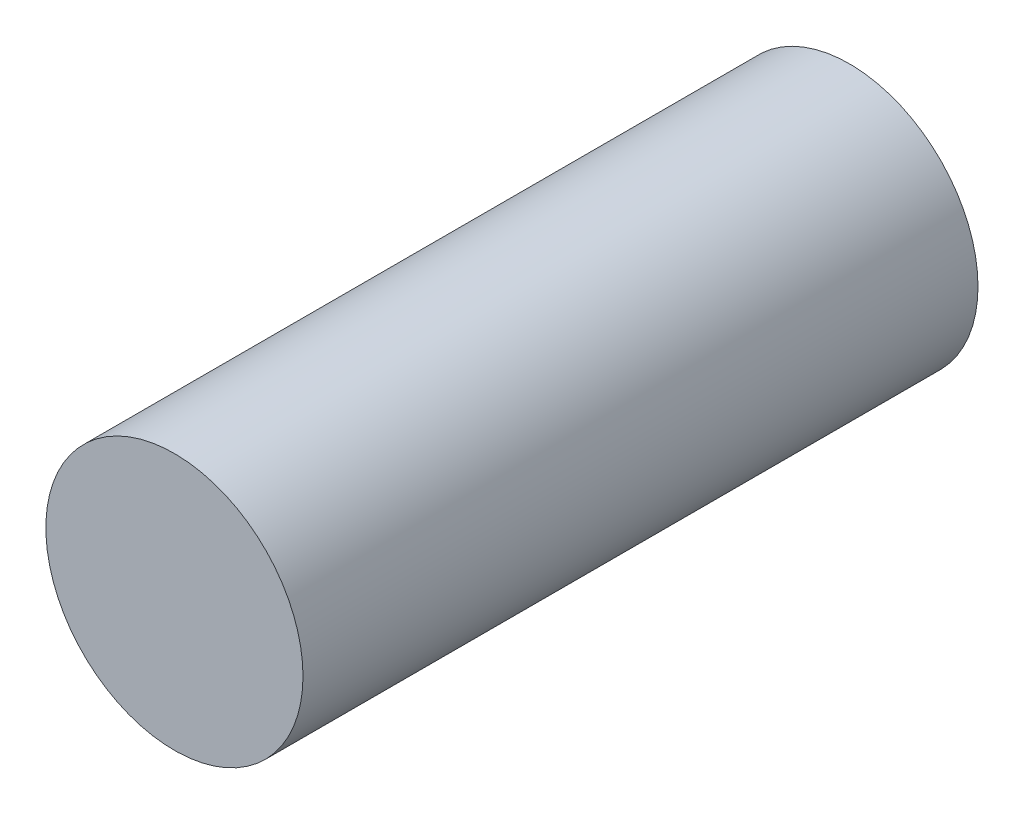
ISO-10303-21;
HEADER;
FILE_DESCRIPTION(('STEP AP214'),'2;1');
FILE_NAME('part.step','',(''),(''),'','','');
FILE_SCHEMA(('AUTOMOTIVE_DESIGN { 1 0 10303 214 1 1 1 1 }'));
ENDSEC;
DATA;
#1=APPLICATION_CONTEXT('core data for automotive mechanical design processes');
#2=APPLICATION_PROTOCOL_DEFINITION('international standard','automotive_design',2000,#1);
#3=PRODUCT_CONTEXT('',#1,'mechanical');
#4=PRODUCT('Part','Part','',(#3));
#5=PRODUCT_RELATED_PRODUCT_CATEGORY('part','',(#4));
#6=PRODUCT_DEFINITION_FORMATION('','',#4);
#7=PRODUCT_DEFINITION_CONTEXT('part definition',#1,'design');
#8=PRODUCT_DEFINITION('design','',#6,#7);
#9=PRODUCT_DEFINITION_SHAPE('','',#8);
#10=(LENGTH_UNIT() NAMED_UNIT(*) SI_UNIT(.MILLI.,.METRE.));
#11=(NAMED_UNIT(*) PLANE_ANGLE_UNIT() SI_UNIT($,.RADIAN.));
#12=(NAMED_UNIT(*) SI_UNIT($,.STERADIAN.) SOLID_ANGLE_UNIT());
#13=UNCERTAINTY_MEASURE_WITH_UNIT(LENGTH_MEASURE(1.E-05),#10,'distance_accuracy_value','');
#14=(GEOMETRIC_REPRESENTATION_CONTEXT(3) GLOBAL_UNCERTAINTY_ASSIGNED_CONTEXT((#13)) GLOBAL_UNIT_ASSIGNED_CONTEXT((#10,
#11,#12)) REPRESENTATION_CONTEXT('',''));
#15=CARTESIAN_POINT('',(0.,0.,0.));
#16=DIRECTION('',(0.,0.,1.));
#17=DIRECTION('',(1.,0.,0.));
#18=AXIS2_PLACEMENT_3D('',#15,#16,#17);
#19=CARTESIAN_POINT('',(0.,0.,210.));
#20=DIRECTION('',(0.,0.,-1.));
#21=DIRECTION('',(-1.,0.,0.));
#22=AXIS2_PLACEMENT_3D('',#19,#20,#21);
#23=CYLINDRICAL_SURFACE('',#22,40.);
#24=CARTESIAN_POINT('',(0.,0.,210.));
#25=DIRECTION('',(0.,0.,1.));
#26=DIRECTION('',(1.,0.,0.));
#27=AXIS2_PLACEMENT_3D('',#24,#25,#26);
#28=CIRCLE('',#27,40.);
#29=CARTESIAN_POINT('',(40.,0.,210.));
#30=VERTEX_POINT('',#29);
#31=EDGE_CURVE('E10',#30,#30,#28,.T.);
#32=ORIENTED_EDGE('',*,*,#31,.F.);
#33=EDGE_LOOP('',(#32));
#34=FACE_BOUND('',#33,.T.);
#35=CARTESIAN_POINT('',(0.,0.,0.));
#36=DIRECTION('',(0.,0.,1.));
#37=DIRECTION('',(1.,0.,0.));
#38=AXIS2_PLACEMENT_3D('',#35,#36,#37);
#39=CIRCLE('',#38,40.);
#40=CARTESIAN_POINT('',(40.,0.,0.));
#41=VERTEX_POINT('',#40);
#42=EDGE_CURVE('E35',#41,#41,#39,.T.);
#43=ORIENTED_EDGE('',*,*,#42,.T.);
#44=EDGE_LOOP('',(#43));
#45=FACE_BOUND('',#44,.T.);
#46=ADVANCED_FACE('F32',(#34,#45),#23,.T.);
#47=CARTESIAN_POINT('',(0.,0.,210.));
#48=DIRECTION('',(0.,0.,1.));
#49=DIRECTION('',(1.,0.,0.));
#50=AXIS2_PLACEMENT_3D('',#47,#48,#49);
#51=PLANE('',#50);
#52=ORIENTED_EDGE('',*,*,#31,.T.);
#53=EDGE_LOOP('',(#52));
#54=FACE_BOUND('',#53,.T.);
#55=ADVANCED_FACE('F47',(#54),#51,.T.);
#56=CARTESIAN_POINT('',(0.,0.,0.));
#57=DIRECTION('',(0.,0.,1.));
#58=DIRECTION('',(1.,0.,0.));
#59=AXIS2_PLACEMENT_3D('',#56,#57,#58);
#60=PLANE('',#59);
#61=ORIENTED_EDGE('',*,*,#42,.F.);
#62=EDGE_LOOP('',(#61));
#63=FACE_BOUND('',#62,.T.);
#64=ADVANCED_FACE('F45',(#63),#60,.F.);
#65=CLOSED_SHELL('',(#46,#55,#64));
#66=MANIFOLD_SOLID_BREP('B2',#65);
#67=ADVANCED_BREP_SHAPE_REPRESENTATION('',(#18,#66),#14);
#68=SHAPE_DEFINITION_REPRESENTATION(#9,#67);
ENDSEC;
END-ISO-10303-21;
